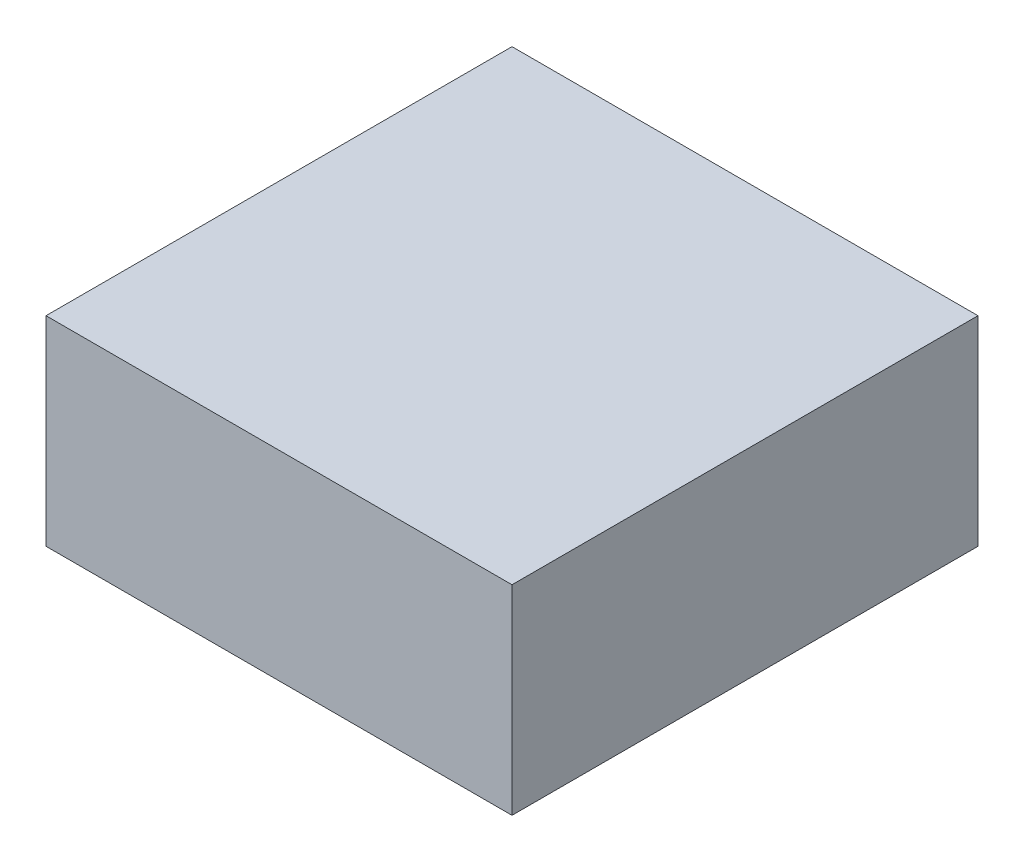
ISO-10303-21;
HEADER;
FILE_DESCRIPTION(('STEP AP214'),'2;1');
FILE_NAME('part.step','',(''),(''),'','','');
FILE_SCHEMA(('AUTOMOTIVE_DESIGN { 1 0 10303 214 1 1 1 1 }'));
ENDSEC;
DATA;
#1=APPLICATION_CONTEXT('core data for automotive mechanical design processes');
#2=APPLICATION_PROTOCOL_DEFINITION('international standard','automotive_design',2000,#1);
#3=PRODUCT_CONTEXT('',#1,'mechanical');
#4=PRODUCT('Part','Part','',(#3));
#5=PRODUCT_RELATED_PRODUCT_CATEGORY('part','',(#4));
#6=PRODUCT_DEFINITION_FORMATION('','',#4);
#7=PRODUCT_DEFINITION_CONTEXT('part definition',#1,'design');
#8=PRODUCT_DEFINITION('design','',#6,#7);
#9=PRODUCT_DEFINITION_SHAPE('','',#8);
#10=(LENGTH_UNIT() NAMED_UNIT(*) SI_UNIT(.MILLI.,.METRE.));
#11=(NAMED_UNIT(*) PLANE_ANGLE_UNIT() SI_UNIT($,.RADIAN.));
#12=(NAMED_UNIT(*) SI_UNIT($,.STERADIAN.) SOLID_ANGLE_UNIT());
#13=UNCERTAINTY_MEASURE_WITH_UNIT(LENGTH_MEASURE(1.E-05),#10,'distance_accuracy_value','');
#14=(GEOMETRIC_REPRESENTATION_CONTEXT(3) GLOBAL_UNCERTAINTY_ASSIGNED_CONTEXT((#13)) GLOBAL_UNIT_ASSIGNED_CONTEXT((#10,
#11,#12)) REPRESENTATION_CONTEXT('',''));
#15=CARTESIAN_POINT('',(0.,0.,0.));
#16=DIRECTION('',(0.,0.,1.));
#17=DIRECTION('',(1.,0.,0.));
#18=AXIS2_PLACEMENT_3D('',#15,#16,#17);
#19=CARTESIAN_POINT('',(0.,0.,177.8));
#20=DIRECTION('',(1.,0.,0.));
#21=DIRECTION('',(0.,0.,-1.));
#22=AXIS2_PLACEMENT_3D('',#19,#20,#21);
#23=PLANE('',#22);
#24=DIRECTION('',(0.,-1.,0.));
#25=VECTOR('',#24,1.);
#26=CARTESIAN_POINT('',(0.,0.,0.));
#27=LINE('',#26,#25);
#28=CARTESIAN_POINT('',(0.,76.2,0.));
#29=VERTEX_POINT('',#28);
#30=CARTESIAN_POINT('',(0.,0.,0.));
#31=VERTEX_POINT('',#30);
#32=EDGE_CURVE('E96',#29,#31,#27,.T.);
#33=ORIENTED_EDGE('',*,*,#32,.T.);
#34=DIRECTION('',(0.,0.,-1.));
#35=VECTOR('',#34,1.);
#36=CARTESIAN_POINT('',(0.,0.,177.8));
#37=LINE('',#36,#35);
#38=CARTESIAN_POINT('',(0.,0.,177.8));
#39=VERTEX_POINT('',#38);
#40=EDGE_CURVE('E11',#39,#31,#37,.T.);
#41=ORIENTED_EDGE('',*,*,#40,.F.);
#42=DIRECTION('',(0.,-1.,0.));
#43=VECTOR('',#42,1.);
#44=CARTESIAN_POINT('',(0.,0.,177.8));
#45=LINE('',#44,#43);
#46=CARTESIAN_POINT('',(0.,76.2,177.8));
#47=VERTEX_POINT('',#46);
#48=EDGE_CURVE('E84',#47,#39,#45,.T.);
#49=ORIENTED_EDGE('',*,*,#48,.F.);
#50=DIRECTION('',(0.,0.,-1.));
#51=VECTOR('',#50,1.);
#52=CARTESIAN_POINT('',(0.,76.2,177.8));
#53=LINE('',#52,#51);
#54=EDGE_CURVE('E92',#47,#29,#53,.T.);
#55=ORIENTED_EDGE('',*,*,#54,.T.);
#56=EDGE_LOOP('',(#33,#41,#49,#55));
#57=FACE_BOUND('',#56,.T.);
#58=ADVANCED_FACE('F33',(#57),#23,.F.);
#59=CARTESIAN_POINT('',(0.,0.,177.8));
#60=DIRECTION('',(0.,1.,0.));
#61=DIRECTION('',(0.,0.,1.));
#62=AXIS2_PLACEMENT_3D('',#59,#60,#61);
#63=PLANE('',#62);
#64=DIRECTION('',(1.,0.,0.));
#65=VECTOR('',#64,1.);
#66=CARTESIAN_POINT('',(0.,0.,0.));
#67=LINE('',#66,#65);
#68=CARTESIAN_POINT('',(177.8,0.,0.));
#69=VERTEX_POINT('',#68);
#70=EDGE_CURVE('E88',#31,#69,#67,.T.);
#71=ORIENTED_EDGE('',*,*,#70,.T.);
#72=DIRECTION('',(0.,0.,-1.));
#73=VECTOR('',#72,1.);
#74=CARTESIAN_POINT('',(177.8,0.,177.8));
#75=LINE('',#74,#73);
#76=CARTESIAN_POINT('',(177.8,0.,177.8));
#77=VERTEX_POINT('',#76);
#78=EDGE_CURVE('E41',#77,#69,#75,.T.);
#79=ORIENTED_EDGE('',*,*,#78,.F.);
#80=DIRECTION('',(1.,0.,0.));
#81=VECTOR('',#80,1.);
#82=CARTESIAN_POINT('',(0.,0.,177.8));
#83=LINE('',#82,#81);
#84=EDGE_CURVE('E79',#39,#77,#83,.T.);
#85=ORIENTED_EDGE('',*,*,#84,.F.);
#86=ORIENTED_EDGE('',*,*,#40,.T.);
#87=EDGE_LOOP('',(#71,#79,#85,#86));
#88=FACE_BOUND('',#87,.T.);
#89=ADVANCED_FACE('F87',(#88),#63,.F.);
#90=CARTESIAN_POINT('',(177.8,0.,177.8));
#91=DIRECTION('',(-1.,0.,0.));
#92=DIRECTION('',(0.,0.,1.));
#93=AXIS2_PLACEMENT_3D('',#90,#91,#92);
#94=PLANE('',#93);
#95=DIRECTION('',(0.,1.,0.));
#96=VECTOR('',#95,1.);
#97=CARTESIAN_POINT('',(177.8,0.,0.));
#98=LINE('',#97,#96);
#99=CARTESIAN_POINT('',(177.8,76.2,0.));
#100=VERTEX_POINT('',#99);
#101=EDGE_CURVE('E66',#69,#100,#98,.T.);
#102=ORIENTED_EDGE('',*,*,#101,.T.);
#103=DIRECTION('',(0.,0.,-1.));
#104=VECTOR('',#103,1.);
#105=CARTESIAN_POINT('',(177.8,76.2,177.8));
#106=LINE('',#105,#104);
#107=CARTESIAN_POINT('',(177.8,76.2,177.8));
#108=VERTEX_POINT('',#107);
#109=EDGE_CURVE('E89',#108,#100,#106,.T.);
#110=ORIENTED_EDGE('',*,*,#109,.F.);
#111=DIRECTION('',(0.,1.,0.));
#112=VECTOR('',#111,1.);
#113=CARTESIAN_POINT('',(177.8,0.,177.8));
#114=LINE('',#113,#112);
#115=EDGE_CURVE('E82',#77,#108,#114,.T.);
#116=ORIENTED_EDGE('',*,*,#115,.F.);
#117=ORIENTED_EDGE('',*,*,#78,.T.);
#118=EDGE_LOOP('',(#102,#110,#116,#117));
#119=FACE_BOUND('',#118,.T.);
#120=ADVANCED_FACE('F90',(#119),#94,.F.);
#121=CARTESIAN_POINT('',(0.,76.2,177.8));
#122=DIRECTION('',(0.,-1.,0.));
#123=DIRECTION('',(0.,0.,-1.));
#124=AXIS2_PLACEMENT_3D('',#121,#122,#123);
#125=PLANE('',#124);
#126=DIRECTION('',(-1.,0.,0.));
#127=VECTOR('',#126,1.);
#128=CARTESIAN_POINT('',(0.,76.2,0.));
#129=LINE('',#128,#127);
#130=EDGE_CURVE('E72',#100,#29,#129,.T.);
#131=ORIENTED_EDGE('',*,*,#130,.T.);
#132=ORIENTED_EDGE('',*,*,#54,.F.);
#133=DIRECTION('',(-1.,0.,0.));
#134=VECTOR('',#133,1.);
#135=CARTESIAN_POINT('',(0.,76.2,177.8));
#136=LINE('',#135,#134);
#137=EDGE_CURVE('E49',#108,#47,#136,.T.);
#138=ORIENTED_EDGE('',*,*,#137,.F.);
#139=ORIENTED_EDGE('',*,*,#109,.T.);
#140=EDGE_LOOP('',(#131,#132,#138,#139));
#141=FACE_BOUND('',#140,.T.);
#142=ADVANCED_FACE('F103',(#141),#125,.F.);
#143=CARTESIAN_POINT('',(0.,0.,177.8));
#144=DIRECTION('',(0.,0.,-1.));
#145=DIRECTION('',(-1.,0.,0.));
#146=AXIS2_PLACEMENT_3D('',#143,#144,#145);
#147=PLANE('',#146);
#148=ORIENTED_EDGE('',*,*,#48,.T.);
#149=ORIENTED_EDGE('',*,*,#84,.T.);
#150=ORIENTED_EDGE('',*,*,#115,.T.);
#151=ORIENTED_EDGE('',*,*,#137,.T.);
#152=EDGE_LOOP('',(#148,#149,#150,#151));
#153=FACE_BOUND('',#152,.T.);
#154=ADVANCED_FACE('F80',(#153),#147,.F.);
#155=CARTESIAN_POINT('',(0.,0.,0.));
#156=DIRECTION('',(0.,0.,-1.));
#157=DIRECTION('',(-1.,0.,0.));
#158=AXIS2_PLACEMENT_3D('',#155,#156,#157);
#159=PLANE('',#158);
#160=ORIENTED_EDGE('',*,*,#32,.F.);
#161=ORIENTED_EDGE('',*,*,#130,.F.);
#162=ORIENTED_EDGE('',*,*,#101,.F.);
#163=ORIENTED_EDGE('',*,*,#70,.F.);
#164=EDGE_LOOP('',(#160,#161,#162,#163));
#165=FACE_BOUND('',#164,.T.);
#166=ADVANCED_FACE('F106',(#165),#159,.T.);
#167=CLOSED_SHELL('',(#58,#89,#120,#142,#154,#166));
#168=MANIFOLD_SOLID_BREP('B2',#167);
#169=ADVANCED_BREP_SHAPE_REPRESENTATION('',(#18,#168),#14);
#170=SHAPE_DEFINITION_REPRESENTATION(#9,#169);
ENDSEC;
END-ISO-10303-21;
